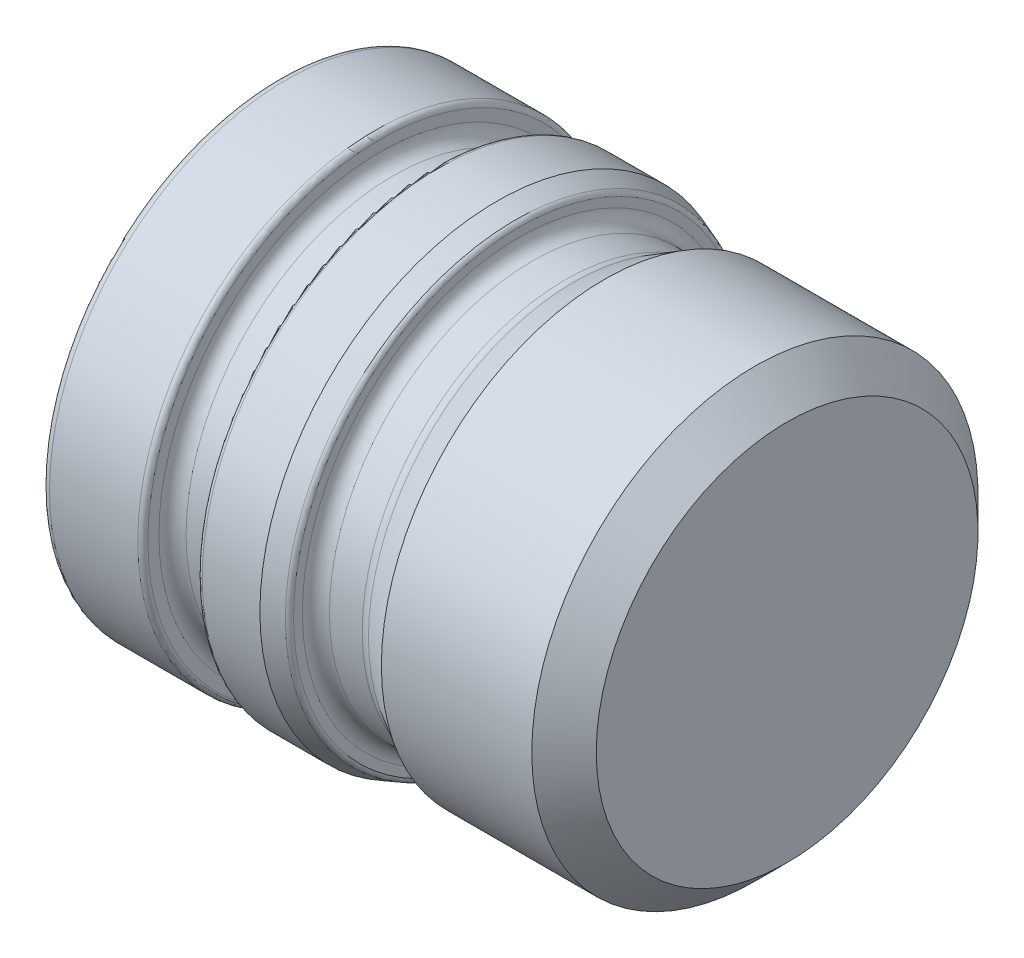
ISO-10303-21;
HEADER;
FILE_DESCRIPTION(('STEP AP214'),'2;1');
FILE_NAME('part.step','',(''),(''),'','','');
FILE_SCHEMA(('AUTOMOTIVE_DESIGN { 1 0 10303 214 1 1 1 1 }'));
ENDSEC;
DATA;
#1=APPLICATION_CONTEXT('core data for automotive mechanical design processes');
#2=APPLICATION_PROTOCOL_DEFINITION('international standard','automotive_design',2000,#1);
#3=PRODUCT_CONTEXT('',#1,'mechanical');
#4=PRODUCT('Part','Part','',(#3));
#5=PRODUCT_RELATED_PRODUCT_CATEGORY('part','',(#4));
#6=PRODUCT_DEFINITION_FORMATION('','',#4);
#7=PRODUCT_DEFINITION_CONTEXT('part definition',#1,'design');
#8=PRODUCT_DEFINITION('design','',#6,#7);
#9=PRODUCT_DEFINITION_SHAPE('','',#8);
#10=(LENGTH_UNIT() NAMED_UNIT(*) SI_UNIT(.MILLI.,.METRE.));
#11=(NAMED_UNIT(*) PLANE_ANGLE_UNIT() SI_UNIT($,.RADIAN.));
#12=(NAMED_UNIT(*) SI_UNIT($,.STERADIAN.) SOLID_ANGLE_UNIT());
#13=UNCERTAINTY_MEASURE_WITH_UNIT(LENGTH_MEASURE(1.E-05),#10,'distance_accuracy_value','');
#14=(GEOMETRIC_REPRESENTATION_CONTEXT(3) GLOBAL_UNCERTAINTY_ASSIGNED_CONTEXT((#13)) GLOBAL_UNIT_ASSIGNED_CONTEXT((#10,
#11,#12)) REPRESENTATION_CONTEXT('',''));
#15=CARTESIAN_POINT('',(0.,0.,0.));
#16=DIRECTION('',(0.,0.,1.));
#17=DIRECTION('',(1.,0.,0.));
#18=AXIS2_PLACEMENT_3D('',#15,#16,#17);
#19=CARTESIAN_POINT('',(-30.,13.475,0.));
#20=DIRECTION('',(1.,0.,0.));
#21=DIRECTION('',(0.,0.,-1.));
#22=AXIS2_PLACEMENT_3D('',#19,#20,#21);
#23=PLANE('',#22);
#24=DIRECTION('',(0.,1.,0.));
#25=VECTOR('',#24,1.);
#26=CARTESIAN_POINT('',(-30.,13.475,-5.5));
#27=LINE('',#26,#25);
#28=CARTESIAN_POINT('',(-30.,-2.32605970270163,-5.5));
#29=VERTEX_POINT('',#28);
#30=CARTESIAN_POINT('',(-30.,2.32605970270163,-5.5));
#31=VERTEX_POINT('',#30);
#32=EDGE_CURVE('E253',#29,#31,#27,.T.);
#33=ORIENTED_EDGE('',*,*,#32,.T.);
#34=CARTESIAN_POINT('',(-30.,3.8,-3.8));
#35=DIRECTION('',(1.,0.,0.));
#36=DIRECTION('',(0.,0.,-1.));
#37=AXIS2_PLACEMENT_3D('',#34,#35,#36);
#38=CIRCLE('',#37,2.25);
#39=CARTESIAN_POINT('',(-30.,5.5,-2.32605970270163));
#40=VERTEX_POINT('',#39);
#41=EDGE_CURVE('E255',#31,#40,#38,.T.);
#42=ORIENTED_EDGE('',*,*,#41,.T.);
#43=DIRECTION('',(0.,0.,1.));
#44=VECTOR('',#43,1.);
#45=CARTESIAN_POINT('',(-30.,5.5,0.));
#46=LINE('',#45,#44);
#47=CARTESIAN_POINT('',(-30.,5.5,2.32605970270163));
#48=VERTEX_POINT('',#47);
#49=EDGE_CURVE('E241',#40,#48,#46,.T.);
#50=ORIENTED_EDGE('',*,*,#49,.T.);
#51=CARTESIAN_POINT('',(-30.,3.8,3.8));
#52=DIRECTION('',(1.,0.,0.));
#53=DIRECTION('',(0.,0.,-1.));
#54=AXIS2_PLACEMENT_3D('',#51,#52,#53);
#55=CIRCLE('',#54,2.25);
#56=CARTESIAN_POINT('',(-30.,2.32605970270163,5.5));
#57=VERTEX_POINT('',#56);
#58=EDGE_CURVE('E243',#48,#57,#55,.T.);
#59=ORIENTED_EDGE('',*,*,#58,.T.);
#60=DIRECTION('',(0.,-1.,0.));
#61=VECTOR('',#60,1.);
#62=CARTESIAN_POINT('',(-30.,13.475,5.5));
#63=LINE('',#62,#61);
#64=CARTESIAN_POINT('',(-30.,-2.32605970270163,5.5));
#65=VERTEX_POINT('',#64);
#66=EDGE_CURVE('E245',#57,#65,#63,.T.);
#67=ORIENTED_EDGE('',*,*,#66,.T.);
#68=CARTESIAN_POINT('',(-30.,-3.8,3.8));
#69=DIRECTION('',(1.,0.,0.));
#70=DIRECTION('',(0.,0.,-1.));
#71=AXIS2_PLACEMENT_3D('',#68,#69,#70);
#72=CIRCLE('',#71,2.25);
#73=CARTESIAN_POINT('',(-30.,-5.25,2.07953494659147));
#74=VERTEX_POINT('',#73);
#75=EDGE_CURVE('E247',#65,#74,#72,.T.);
#76=ORIENTED_EDGE('',*,*,#75,.T.);
#77=DIRECTION('',(0.,0.,-1.));
#78=VECTOR('',#77,1.);
#79=CARTESIAN_POINT('',(-30.,-5.25,0.));
#80=LINE('',#79,#78);
#81=CARTESIAN_POINT('',(-30.,-5.25,-2.07953494659147));
#82=VERTEX_POINT('',#81);
#83=EDGE_CURVE('E249',#74,#82,#80,.T.);
#84=ORIENTED_EDGE('',*,*,#83,.T.);
#85=CARTESIAN_POINT('',(-30.,-3.8,-3.8));
#86=DIRECTION('',(1.,0.,0.));
#87=DIRECTION('',(0.,0.,-1.));
#88=AXIS2_PLACEMENT_3D('',#85,#86,#87);
#89=CIRCLE('',#88,2.25);
#90=EDGE_CURVE('E251',#82,#29,#89,.T.);
#91=ORIENTED_EDGE('',*,*,#90,.T.);
#92=EDGE_LOOP('',(#33,#42,#50,#59,#67,#76,#84,#91));
#93=FACE_BOUND('',#92,.T.);
#94=CARTESIAN_POINT('',(-30.,0.,0.));
#95=DIRECTION('',(-1.,0.,0.));
#96=DIRECTION('',(0.,0.,1.));
#97=AXIS2_PLACEMENT_3D('',#94,#95,#96);
#98=CIRCLE('',#97,13.475);
#99=CARTESIAN_POINT('',(-30.,0.,13.475));
#100=VERTEX_POINT('',#99);
#101=EDGE_CURVE('E237',#100,#100,#98,.T.);
#102=ORIENTED_EDGE('',*,*,#101,.T.);
#103=EDGE_LOOP('',(#102));
#104=FACE_BOUND('',#103,.T.);
#105=ADVANCED_FACE('F45',(#93,#104),#23,.F.);
#106=CARTESIAN_POINT('',(-29.5,0.,0.));
#107=DIRECTION('',(-1.,0.,0.));
#108=DIRECTION('',(0.,0.,1.));
#109=AXIS2_PLACEMENT_3D('',#106,#107,#108);
#110=TOROIDAL_SURFACE('',#109,13.475,0.5);
#111=ORIENTED_EDGE('',*,*,#101,.F.);
#112=EDGE_LOOP('',(#111));
#113=FACE_BOUND('',#112,.T.);
#114=CARTESIAN_POINT('',(-29.5,0.,0.));
#115=DIRECTION('',(-1.,0.,0.));
#116=DIRECTION('',(0.,0.,1.));
#117=AXIS2_PLACEMENT_3D('',#114,#115,#116);
#118=CIRCLE('',#117,13.975);
#119=CARTESIAN_POINT('',(-29.5,0.,13.975));
#120=VERTEX_POINT('',#119);
#121=EDGE_CURVE('E234',#120,#120,#118,.T.);
#122=ORIENTED_EDGE('',*,*,#121,.T.);
#123=EDGE_LOOP('',(#122));
#124=FACE_BOUND('',#123,.T.);
#125=ADVANCED_FACE('F351',(#113,#124),#110,.T.);
#126=CARTESIAN_POINT('',(0.,0.,0.));
#127=DIRECTION('',(-1.,0.,0.));
#128=DIRECTION('',(0.,0.,1.));
#129=AXIS2_PLACEMENT_3D('',#126,#127,#128);
#130=CYLINDRICAL_SURFACE('',#129,13.975);
#131=ORIENTED_EDGE('',*,*,#121,.F.);
#132=EDGE_LOOP('',(#131));
#133=FACE_BOUND('',#132,.T.);
#134=CARTESIAN_POINT('',(-24.3,0.,0.));
#135=DIRECTION('',(-1.,0.,0.));
#136=DIRECTION('',(0.,0.,1.));
#137=AXIS2_PLACEMENT_3D('',#134,#135,#136);
#138=CIRCLE('',#137,13.975);
#139=CARTESIAN_POINT('',(-24.3,0.,13.975));
#140=VERTEX_POINT('',#139);
#141=EDGE_CURVE('E231',#140,#140,#138,.T.);
#142=ORIENTED_EDGE('',*,*,#141,.T.);
#143=EDGE_LOOP('',(#142));
#144=FACE_BOUND('',#143,.T.);
#145=ADVANCED_FACE('F358',(#133,#144),#130,.T.);
#146=CARTESIAN_POINT('',(-24.3,0.,0.));
#147=DIRECTION('',(-1.,0.,0.));
#148=DIRECTION('',(0.,0.,1.));
#149=AXIS2_PLACEMENT_3D('',#146,#147,#148);
#150=TOROIDAL_SURFACE('',#149,13.675,0.300000000000001);
#151=ORIENTED_EDGE('',*,*,#141,.F.);
#152=EDGE_LOOP('',(#151));
#153=FACE_BOUND('',#152,.T.);
#154=CARTESIAN_POINT('',(-24.,0.,0.));
#155=DIRECTION('',(-1.,0.,0.));
#156=DIRECTION('',(0.,0.,1.));
#157=AXIS2_PLACEMENT_3D('',#154,#155,#156);
#158=CIRCLE('',#157,13.675);
#159=CARTESIAN_POINT('',(-24.,0.,13.675));
#160=VERTEX_POINT('',#159);
#161=EDGE_CURVE('E228',#160,#160,#158,.T.);
#162=ORIENTED_EDGE('',*,*,#161,.T.);
#163=EDGE_LOOP('',(#162));
#164=FACE_BOUND('',#163,.T.);
#165=ADVANCED_FACE('F365',(#153,#164),#150,.T.);
#166=CARTESIAN_POINT('',(-24.,13.025,0.));
#167=DIRECTION('',(-1.,0.,0.));
#168=DIRECTION('',(0.,0.,1.));
#169=AXIS2_PLACEMENT_3D('',#166,#167,#168);
#170=PLANE('',#169);
#171=ORIENTED_EDGE('',*,*,#161,.F.);
#172=EDGE_LOOP('',(#171));
#173=FACE_BOUND('',#172,.T.);
#174=CARTESIAN_POINT('',(-24.,0.,0.));
#175=DIRECTION('',(-1.,0.,0.));
#176=DIRECTION('',(0.,0.,1.));
#177=AXIS2_PLACEMENT_3D('',#174,#175,#176);
#178=CIRCLE('',#177,13.025);
#179=CARTESIAN_POINT('',(-24.,0.,13.025));
#180=VERTEX_POINT('',#179);
#181=EDGE_CURVE('E225',#180,#180,#178,.T.);
#182=ORIENTED_EDGE('',*,*,#181,.T.);
#183=EDGE_LOOP('',(#182));
#184=FACE_BOUND('',#183,.T.);
#185=ADVANCED_FACE('F369',(#173,#184),#170,.F.);
#186=CARTESIAN_POINT('',(-23.2,0.,0.));
#187=DIRECTION('',(-1.,0.,0.));
#188=DIRECTION('',(0.,0.,1.));
#189=AXIS2_PLACEMENT_3D('',#186,#187,#188);
#190=TOROIDAL_SURFACE('',#189,13.025,0.799999999999999);
#191=ORIENTED_EDGE('',*,*,#181,.F.);
#192=EDGE_LOOP('',(#191));
#193=FACE_BOUND('',#192,.T.);
#194=CARTESIAN_POINT('',(-23.2,0.,0.));
#195=DIRECTION('',(-1.,0.,0.));
#196=DIRECTION('',(0.,0.,1.));
#197=AXIS2_PLACEMENT_3D('',#194,#195,#196);
#198=CIRCLE('',#197,12.225);
#199=CARTESIAN_POINT('',(-23.2,0.,12.225));
#200=VERTEX_POINT('',#199);
#201=EDGE_CURVE('E222',#200,#200,#198,.T.);
#202=ORIENTED_EDGE('',*,*,#201,.T.);
#203=EDGE_LOOP('',(#202));
#204=FACE_BOUND('',#203,.T.);
#205=ADVANCED_FACE('F373',(#193,#204),#190,.F.);
#206=CARTESIAN_POINT('',(0.,0.,0.));
#207=DIRECTION('',(-1.,0.,0.));
#208=DIRECTION('',(0.,0.,1.));
#209=AXIS2_PLACEMENT_3D('',#206,#207,#208);
#210=CYLINDRICAL_SURFACE('',#209,12.225);
#211=ORIENTED_EDGE('',*,*,#201,.F.);
#212=EDGE_LOOP('',(#211));
#213=FACE_BOUND('',#212,.T.);
#214=CARTESIAN_POINT('',(-21.6,0.,0.));
#215=DIRECTION('',(-1.,0.,0.));
#216=DIRECTION('',(0.,0.,1.));
#217=AXIS2_PLACEMENT_3D('',#214,#215,#216);
#218=CIRCLE('',#217,12.225);
#219=CARTESIAN_POINT('',(-21.6,0.,12.225));
#220=VERTEX_POINT('',#219);
#221=EDGE_CURVE('E219',#220,#220,#218,.T.);
#222=ORIENTED_EDGE('',*,*,#221,.T.);
#223=EDGE_LOOP('',(#222));
#224=FACE_BOUND('',#223,.T.);
#225=ADVANCED_FACE('F377',(#213,#224),#210,.T.);
#226=CARTESIAN_POINT('',(-21.6,0.,0.));
#227=DIRECTION('',(-1.,0.,0.));
#228=DIRECTION('',(0.,0.,1.));
#229=AXIS2_PLACEMENT_3D('',#226,#227,#228);
#230=TOROIDAL_SURFACE('',#229,13.025,0.800000000000001);
#231=ORIENTED_EDGE('',*,*,#221,.F.);
#232=EDGE_LOOP('',(#231));
#233=FACE_BOUND('',#232,.T.);
#234=CARTESIAN_POINT('',(-20.8,0.,0.));
#235=DIRECTION('',(-1.,0.,0.));
#236=DIRECTION('',(0.,0.,1.));
#237=AXIS2_PLACEMENT_3D('',#234,#235,#236);
#238=CIRCLE('',#237,13.025);
#239=CARTESIAN_POINT('',(-20.8,0.,13.025));
#240=VERTEX_POINT('',#239);
#241=EDGE_CURVE('E216',#240,#240,#238,.T.);
#242=ORIENTED_EDGE('',*,*,#241,.T.);
#243=EDGE_LOOP('',(#242));
#244=FACE_BOUND('',#243,.T.);
#245=ADVANCED_FACE('F381',(#233,#244),#230,.F.);
#246=CARTESIAN_POINT('',(-20.8,13.675,0.));
#247=DIRECTION('',(1.,0.,0.));
#248=DIRECTION('',(0.,0.,-1.));
#249=AXIS2_PLACEMENT_3D('',#246,#247,#248);
#250=PLANE('',#249);
#251=ORIENTED_EDGE('',*,*,#241,.F.);
#252=EDGE_LOOP('',(#251));
#253=FACE_BOUND('',#252,.T.);
#254=CARTESIAN_POINT('',(-20.8,0.,0.));
#255=DIRECTION('',(-1.,0.,0.));
#256=DIRECTION('',(0.,0.,1.));
#257=AXIS2_PLACEMENT_3D('',#254,#255,#256);
#258=CIRCLE('',#257,13.675);
#259=CARTESIAN_POINT('',(-20.8,0.,13.675));
#260=VERTEX_POINT('',#259);
#261=EDGE_CURVE('E213',#260,#260,#258,.T.);
#262=ORIENTED_EDGE('',*,*,#261,.T.);
#263=EDGE_LOOP('',(#262));
#264=FACE_BOUND('',#263,.T.);
#265=ADVANCED_FACE('F385',(#253,#264),#250,.F.);
#266=CARTESIAN_POINT('',(-20.5,0.,0.));
#267=DIRECTION('',(-1.,0.,0.));
#268=DIRECTION('',(0.,0.,1.));
#269=AXIS2_PLACEMENT_3D('',#266,#267,#268);
#270=TOROIDAL_SURFACE('',#269,13.675,0.299999999999998);
#271=ORIENTED_EDGE('',*,*,#261,.F.);
#272=EDGE_LOOP('',(#271));
#273=FACE_BOUND('',#272,.T.);
#274=CARTESIAN_POINT('',(-20.5,0.,0.));
#275=DIRECTION('',(-1.,0.,0.));
#276=DIRECTION('',(0.,0.,1.));
#277=AXIS2_PLACEMENT_3D('',#274,#275,#276);
#278=CIRCLE('',#277,13.975);
#279=CARTESIAN_POINT('',(-20.5,0.,13.975));
#280=VERTEX_POINT('',#279);
#281=EDGE_CURVE('E210',#280,#280,#278,.T.);
#282=ORIENTED_EDGE('',*,*,#281,.T.);
#283=EDGE_LOOP('',(#282));
#284=FACE_BOUND('',#283,.T.);
#285=ADVANCED_FACE('F389',(#273,#284),#270,.T.);
#286=CARTESIAN_POINT('',(0.,0.,0.));
#287=DIRECTION('',(-1.,0.,0.));
#288=DIRECTION('',(0.,0.,1.));
#289=AXIS2_PLACEMENT_3D('',#286,#287,#288);
#290=CYLINDRICAL_SURFACE('',#289,13.975);
#291=ORIENTED_EDGE('',*,*,#281,.F.);
#292=EDGE_LOOP('',(#291));
#293=FACE_BOUND('',#292,.T.);
#294=CARTESIAN_POINT('',(-17.1,0.,0.));
#295=DIRECTION('',(-1.,0.,0.));
#296=DIRECTION('',(0.,0.,1.));
#297=AXIS2_PLACEMENT_3D('',#294,#295,#296);
#298=CIRCLE('',#297,13.975);
#299=CARTESIAN_POINT('',(-17.1,0.,13.975));
#300=VERTEX_POINT('',#299);
#301=EDGE_CURVE('E207',#300,#300,#298,.T.);
#302=ORIENTED_EDGE('',*,*,#301,.T.);
#303=EDGE_LOOP('',(#302));
#304=FACE_BOUND('',#303,.T.);
#305=ADVANCED_FACE('F393',(#293,#304),#290,.T.);
#306=CARTESIAN_POINT('',(-15.9973939570023,0.,0.));
#307=DIRECTION('',(-1.,0.,0.));
#308=DIRECTION('',(0.,0.,1.));
#309=AXIS2_PLACEMENT_3D('',#306,#307,#308);
#310=CONICAL_SURFACE('',#309,13.5736842202268,0.349065850398858);
#311=ORIENTED_EDGE('',*,*,#301,.F.);
#312=EDGE_LOOP('',(#311));
#313=FACE_BOUND('',#312,.T.);
#314=CARTESIAN_POINT('',(-15.9973939570023,0.,0.));
#315=DIRECTION('',(-1.,0.,0.));
#316=DIRECTION('',(0.,0.,1.));
#317=AXIS2_PLACEMENT_3D('',#314,#315,#316);
#318=CIRCLE('',#317,13.5736842202268);
#319=CARTESIAN_POINT('',(-15.9973939570023,0.,13.5736842202268));
#320=VERTEX_POINT('',#319);
#321=EDGE_CURVE('E204',#320,#320,#318,.T.);
#322=ORIENTED_EDGE('',*,*,#321,.T.);
#323=EDGE_LOOP('',(#322));
#324=FACE_BOUND('',#323,.T.);
#325=ADVANCED_FACE('F397',(#313,#324),#310,.T.);
#326=CARTESIAN_POINT('',(-16.1,0.,0.));
#327=DIRECTION('',(-1.,0.,0.));
#328=DIRECTION('',(0.,0.,1.));
#329=AXIS2_PLACEMENT_3D('',#326,#327,#328);
#330=TOROIDAL_SURFACE('',#329,13.291776433991,0.300000000000002);
#331=ORIENTED_EDGE('',*,*,#321,.F.);
#332=EDGE_LOOP('',(#331));
#333=FACE_BOUND('',#332,.T.);
#334=CARTESIAN_POINT('',(-15.8,0.,0.));
#335=DIRECTION('',(-1.,0.,0.));
#336=DIRECTION('',(0.,0.,1.));
#337=AXIS2_PLACEMENT_3D('',#334,#335,#336);
#338=CIRCLE('',#337,13.291776433991);
#339=CARTESIAN_POINT('',(-15.8,0.,13.291776433991));
#340=VERTEX_POINT('',#339);
#341=EDGE_CURVE('E201',#340,#340,#338,.T.);
#342=ORIENTED_EDGE('',*,*,#341,.T.);
#343=EDGE_LOOP('',(#342));
#344=FACE_BOUND('',#343,.T.);
#345=ADVANCED_FACE('F401',(#333,#344),#330,.T.);
#346=CARTESIAN_POINT('',(-15.8,12.775,0.));
#347=DIRECTION('',(-1.,0.,0.));
#348=DIRECTION('',(0.,0.,1.));
#349=AXIS2_PLACEMENT_3D('',#346,#347,#348);
#350=PLANE('',#349);
#351=ORIENTED_EDGE('',*,*,#341,.F.);
#352=EDGE_LOOP('',(#351));
#353=FACE_BOUND('',#352,.T.);
#354=CARTESIAN_POINT('',(-15.8,0.,0.));
#355=DIRECTION('',(-1.,0.,0.));
#356=DIRECTION('',(0.,0.,1.));
#357=AXIS2_PLACEMENT_3D('',#354,#355,#356);
#358=CIRCLE('',#357,12.775);
#359=CARTESIAN_POINT('',(-15.8,0.,12.775));
#360=VERTEX_POINT('',#359);
#361=EDGE_CURVE('E198',#360,#360,#358,.T.);
#362=ORIENTED_EDGE('',*,*,#361,.T.);
#363=EDGE_LOOP('',(#362));
#364=FACE_BOUND('',#363,.T.);
#365=ADVANCED_FACE('F405',(#353,#364),#350,.F.);
#366=CARTESIAN_POINT('',(-15.,0.,0.));
#367=DIRECTION('',(-1.,0.,0.));
#368=DIRECTION('',(0.,0.,1.));
#369=AXIS2_PLACEMENT_3D('',#366,#367,#368);
#370=TOROIDAL_SURFACE('',#369,12.775,0.8);
#371=ORIENTED_EDGE('',*,*,#361,.F.);
#372=EDGE_LOOP('',(#371));
#373=FACE_BOUND('',#372,.T.);
#374=CARTESIAN_POINT('',(-15.,0.,0.));
#375=DIRECTION('',(-1.,0.,0.));
#376=DIRECTION('',(0.,0.,1.));
#377=AXIS2_PLACEMENT_3D('',#374,#375,#376);
#378=CIRCLE('',#377,11.975);
#379=CARTESIAN_POINT('',(-15.,0.,11.975));
#380=VERTEX_POINT('',#379);
#381=EDGE_CURVE('E195',#380,#380,#378,.T.);
#382=ORIENTED_EDGE('',*,*,#381,.T.);
#383=EDGE_LOOP('',(#382));
#384=FACE_BOUND('',#383,.T.);
#385=ADVANCED_FACE('F409',(#373,#384),#370,.F.);
#386=CARTESIAN_POINT('',(0.,0.,0.));
#387=DIRECTION('',(-1.,0.,0.));
#388=DIRECTION('',(0.,0.,1.));
#389=AXIS2_PLACEMENT_3D('',#386,#387,#388);
#390=CYLINDRICAL_SURFACE('',#389,11.975);
#391=ORIENTED_EDGE('',*,*,#381,.F.);
#392=EDGE_LOOP('',(#391));
#393=FACE_BOUND('',#392,.T.);
#394=CARTESIAN_POINT('',(-13.0679491924311,0.,0.));
#395=DIRECTION('',(-1.,0.,0.));
#396=DIRECTION('',(0.,0.,1.));
#397=AXIS2_PLACEMENT_3D('',#394,#395,#396);
#398=CIRCLE('',#397,11.975);
#399=CARTESIAN_POINT('',(-13.0679491924311,0.,11.975));
#400=VERTEX_POINT('',#399);
#401=EDGE_CURVE('E192',#400,#400,#398,.T.);
#402=ORIENTED_EDGE('',*,*,#401,.T.);
#403=EDGE_LOOP('',(#402));
#404=FACE_BOUND('',#403,.T.);
#405=ADVANCED_FACE('F413',(#393,#404),#390,.T.);
#406=CARTESIAN_POINT('',(-13.0679491924311,0.,0.));
#407=DIRECTION('',(-1.,0.,0.));
#408=DIRECTION('',(0.,0.,1.));
#409=AXIS2_PLACEMENT_3D('',#406,#407,#408);
#410=TOROIDAL_SURFACE('',#409,12.975,1.);
#411=ORIENTED_EDGE('',*,*,#401,.F.);
#412=EDGE_LOOP('',(#411));
#413=FACE_BOUND('',#412,.T.);
#414=CARTESIAN_POINT('',(-12.5679491924311,0.,0.));
#415=DIRECTION('',(-1.,0.,0.));
#416=DIRECTION('',(0.,0.,1.));
#417=AXIS2_PLACEMENT_3D('',#414,#415,#416);
#418=CIRCLE('',#417,12.1089745962156);
#419=CARTESIAN_POINT('',(-12.5679491924311,0.,12.1089745962156));
#420=VERTEX_POINT('',#419);
#421=EDGE_CURVE('E189',#420,#420,#418,.T.);
#422=ORIENTED_EDGE('',*,*,#421,.T.);
#423=EDGE_LOOP('',(#422));
#424=FACE_BOUND('',#423,.T.);
#425=ADVANCED_FACE('F417',(#413,#424),#410,.F.);
#426=CARTESIAN_POINT('',(-10.7648403011066,0.,0.));
#427=DIRECTION('',(1.,0.,0.));
#428=DIRECTION('',(0.,0.,-1.));
#429=AXIS2_PLACEMENT_3D('',#426,#427,#428);
#430=CONICAL_SURFACE('',#429,13.15,0.5235987755983);
#431=ORIENTED_EDGE('',*,*,#421,.F.);
#432=EDGE_LOOP('',(#431));
#433=FACE_BOUND('',#432,.T.);
#434=CARTESIAN_POINT('',(-10.7648403011066,0.,0.));
#435=DIRECTION('',(-1.,0.,0.));
#436=DIRECTION('',(0.,0.,1.));
#437=AXIS2_PLACEMENT_3D('',#434,#435,#436);
#438=CIRCLE('',#437,13.15);
#439=CARTESIAN_POINT('',(-10.7648403011066,0.,13.15));
#440=VERTEX_POINT('',#439);
#441=EDGE_CURVE('E186',#440,#440,#438,.T.);
#442=ORIENTED_EDGE('',*,*,#441,.T.);
#443=EDGE_LOOP('',(#442));
#444=FACE_BOUND('',#443,.T.);
#445=ADVANCED_FACE('F421',(#433,#444),#430,.T.);
#446=CARTESIAN_POINT('',(0.,0.,0.));
#447=DIRECTION('',(-1.,0.,0.));
#448=DIRECTION('',(0.,0.,1.));
#449=AXIS2_PLACEMENT_3D('',#446,#447,#448);
#450=CYLINDRICAL_SURFACE('',#449,13.15);
#451=ORIENTED_EDGE('',*,*,#441,.F.);
#452=EDGE_LOOP('',(#451));
#453=FACE_BOUND('',#452,.T.);
#454=CARTESIAN_POINT('',(-1.89999999999999,0.,0.));
#455=DIRECTION('',(-1.,0.,0.));
#456=DIRECTION('',(0.,0.,1.));
#457=AXIS2_PLACEMENT_3D('',#454,#455,#456);
#458=CIRCLE('',#457,13.15);
#459=CARTESIAN_POINT('',(-1.89999999999999,0.,13.15));
#460=VERTEX_POINT('',#459);
#461=EDGE_CURVE('E183',#460,#460,#458,.T.);
#462=ORIENTED_EDGE('',*,*,#461,.T.);
#463=EDGE_LOOP('',(#462));
#464=FACE_BOUND('',#463,.T.);
#465=ADVANCED_FACE('F425',(#453,#464),#450,.T.);
#466=CARTESIAN_POINT('',(0.,0.,0.));
#467=DIRECTION('',(-1.,0.,0.));
#468=DIRECTION('',(0.,0.,1.));
#469=AXIS2_PLACEMENT_3D('',#466,#467,#468);
#470=CONICAL_SURFACE('',#469,11.25,0.78539816339745);
#471=ORIENTED_EDGE('',*,*,#461,.F.);
#472=EDGE_LOOP('',(#471));
#473=FACE_BOUND('',#472,.T.);
#474=CARTESIAN_POINT('',(0.,0.,0.));
#475=DIRECTION('',(-1.,0.,0.));
#476=DIRECTION('',(0.,0.,1.));
#477=AXIS2_PLACEMENT_3D('',#474,#475,#476);
#478=CIRCLE('',#477,11.25);
#479=CARTESIAN_POINT('',(0.,0.,11.25));
#480=VERTEX_POINT('',#479);
#481=EDGE_CURVE('E180',#480,#480,#478,.T.);
#482=ORIENTED_EDGE('',*,*,#481,.T.);
#483=EDGE_LOOP('',(#482));
#484=FACE_BOUND('',#483,.T.);
#485=ADVANCED_FACE('F429',(#473,#484),#470,.T.);
#486=CARTESIAN_POINT('',(0.,0.,0.));
#487=DIRECTION('',(-1.,0.,0.));
#488=DIRECTION('',(0.,0.,1.));
#489=AXIS2_PLACEMENT_3D('',#486,#487,#488);
#490=PLANE('',#489);
#491=ORIENTED_EDGE('',*,*,#481,.F.);
#492=EDGE_LOOP('',(#491));
#493=FACE_BOUND('',#492,.T.);
#494=ADVANCED_FACE('F433',(#493),#490,.F.);
#495=CARTESIAN_POINT('',(-20.,5.,-5.));
#496=DIRECTION('',(0.,0.,-1.));
#497=DIRECTION('',(0.,1.,0.));
#498=AXIS2_PLACEMENT_3D('',#495,#496,#497);
#499=PLANE('',#498);
#500=DIRECTION('',(-1.,0.,0.));
#501=VECTOR('',#500,1.);
#502=CARTESIAN_POINT('',(-15.0502525316942,2.5262260797143,-5.));
#503=LINE('',#502,#501);
#504=CARTESIAN_POINT('',(-20.,2.5262260797143,-5.));
#505=VERTEX_POINT('',#504);
#506=CARTESIAN_POINT('',(-29.5,2.5262260797143,-5.));
#507=VERTEX_POINT('',#506);
#508=EDGE_CURVE('E141',#505,#507,#503,.T.);
#509=ORIENTED_EDGE('',*,*,#508,.T.);
#510=DIRECTION('',(0.,-1.,0.));
#511=VECTOR('',#510,1.);
#512=CARTESIAN_POINT('',(-29.5,5.,-5.));
#513=LINE('',#512,#511);
#514=CARTESIAN_POINT('',(-29.5,-2.5262260797143,-5.));
#515=VERTEX_POINT('',#514);
#516=EDGE_CURVE('E258',#507,#515,#513,.T.);
#517=ORIENTED_EDGE('',*,*,#516,.T.);
#518=DIRECTION('',(-1.,0.,0.));
#519=VECTOR('',#518,1.);
#520=CARTESIAN_POINT('',(-15.0502525316942,-2.5262260797143,-5.));
#521=LINE('',#520,#519);
#522=CARTESIAN_POINT('',(-20.,-2.5262260797143,-5.));
#523=VERTEX_POINT('',#522);
#524=EDGE_CURVE('E165',#515,#523,#521,.F.);
#525=ORIENTED_EDGE('',*,*,#524,.T.);
#526=DIRECTION('',(0.,-1.,0.));
#527=VECTOR('',#526,1.);
#528=CARTESIAN_POINT('',(-20.,5.,-5.));
#529=LINE('',#528,#527);
#530=EDGE_CURVE('E157',#505,#523,#529,.T.);
#531=ORIENTED_EDGE('',*,*,#530,.F.);
#532=EDGE_LOOP('',(#509,#517,#525,#531));
#533=FACE_BOUND('',#532,.T.);
#534=ADVANCED_FACE('F163',(#533),#499,.F.);
#535=CARTESIAN_POINT('',(-20.,5.,-5.));
#536=DIRECTION('',(0.,1.,0.));
#537=DIRECTION('',(0.,0.,1.));
#538=AXIS2_PLACEMENT_3D('',#535,#536,#537);
#539=PLANE('',#538);
#540=DIRECTION('',(-1.,0.,0.));
#541=VECTOR('',#540,1.);
#542=CARTESIAN_POINT('',(-15.0502525316942,5.,2.5262260797143));
#543=LINE('',#542,#541);
#544=CARTESIAN_POINT('',(-20.,5.,2.5262260797143));
#545=VERTEX_POINT('',#544);
#546=CARTESIAN_POINT('',(-29.5,5.,2.5262260797143));
#547=VERTEX_POINT('',#546);
#548=EDGE_CURVE('E168',#545,#547,#543,.T.);
#549=ORIENTED_EDGE('',*,*,#548,.T.);
#550=DIRECTION('',(0.,0.,-1.));
#551=VECTOR('',#550,1.);
#552=CARTESIAN_POINT('',(-29.5,5.,-5.));
#553=LINE('',#552,#551);
#554=CARTESIAN_POINT('',(-29.5,5.,-2.5262260797143));
#555=VERTEX_POINT('',#554);
#556=EDGE_CURVE('E11',#547,#555,#553,.T.);
#557=ORIENTED_EDGE('',*,*,#556,.T.);
#558=DIRECTION('',(-1.,0.,0.));
#559=VECTOR('',#558,1.);
#560=CARTESIAN_POINT('',(-15.0502525316942,5.,-2.5262260797143));
#561=LINE('',#560,#559);
#562=CARTESIAN_POINT('',(-20.,5.,-2.5262260797143));
#563=VERTEX_POINT('',#562);
#564=EDGE_CURVE('E152',#555,#563,#561,.F.);
#565=ORIENTED_EDGE('',*,*,#564,.T.);
#566=DIRECTION('',(0.,0.,-1.));
#567=VECTOR('',#566,1.);
#568=CARTESIAN_POINT('',(-20.,5.,-5.));
#569=LINE('',#568,#567);
#570=EDGE_CURVE('E160',#545,#563,#569,.T.);
#571=ORIENTED_EDGE('',*,*,#570,.F.);
#572=EDGE_LOOP('',(#549,#557,#565,#571));
#573=FACE_BOUND('',#572,.T.);
#574=ADVANCED_FACE('F439',(#573),#539,.F.);
#575=CARTESIAN_POINT('',(-20.,5.,5.));
#576=DIRECTION('',(0.,0.,1.));
#577=DIRECTION('',(0.,-1.,0.));
#578=AXIS2_PLACEMENT_3D('',#575,#576,#577);
#579=PLANE('',#578);
#580=DIRECTION('',(-1.,0.,0.));
#581=VECTOR('',#580,1.);
#582=CARTESIAN_POINT('',(-15.0502525316942,-2.5262260797143,5.));
#583=LINE('',#582,#581);
#584=CARTESIAN_POINT('',(-20.,-2.5262260797143,5.));
#585=VERTEX_POINT('',#584);
#586=CARTESIAN_POINT('',(-29.5,-2.5262260797143,5.));
#587=VERTEX_POINT('',#586);
#588=EDGE_CURVE('E471',#585,#587,#583,.T.);
#589=ORIENTED_EDGE('',*,*,#588,.T.);
#590=DIRECTION('',(0.,1.,0.));
#591=VECTOR('',#590,1.);
#592=CARTESIAN_POINT('',(-29.5,5.,5.));
#593=LINE('',#592,#591);
#594=CARTESIAN_POINT('',(-29.5,2.5262260797143,5.));
#595=VERTEX_POINT('',#594);
#596=EDGE_CURVE('E74',#587,#595,#593,.T.);
#597=ORIENTED_EDGE('',*,*,#596,.T.);
#598=DIRECTION('',(-1.,0.,0.));
#599=VECTOR('',#598,1.);
#600=CARTESIAN_POINT('',(-15.0502525316942,2.5262260797143,5.));
#601=LINE('',#600,#599);
#602=CARTESIAN_POINT('',(-20.,2.5262260797143,5.));
#603=VERTEX_POINT('',#602);
#604=EDGE_CURVE('E173',#595,#603,#601,.F.);
#605=ORIENTED_EDGE('',*,*,#604,.T.);
#606=DIRECTION('',(0.,1.,0.));
#607=VECTOR('',#606,1.);
#608=CARTESIAN_POINT('',(-20.,5.,5.));
#609=LINE('',#608,#607);
#610=EDGE_CURVE('E171',#585,#603,#609,.T.);
#611=ORIENTED_EDGE('',*,*,#610,.F.);
#612=EDGE_LOOP('',(#589,#597,#605,#611));
#613=FACE_BOUND('',#612,.T.);
#614=ADVANCED_FACE('F443',(#613),#579,.F.);
#615=CARTESIAN_POINT('',(-20.,-4.75,-5.));
#616=DIRECTION('',(0.,-1.,0.));
#617=DIRECTION('',(0.,0.,-1.));
#618=AXIS2_PLACEMENT_3D('',#615,#616,#617);
#619=PLANE('',#618);
#620=DIRECTION('',(-1.,0.,0.));
#621=VECTOR('',#620,1.);
#622=CARTESIAN_POINT('',(-15.0502525316942,-4.75,-2.33030615433009));
#623=LINE('',#622,#621);
#624=CARTESIAN_POINT('',(-20.,-4.75,-2.33030615433009));
#625=VERTEX_POINT('',#624);
#626=CARTESIAN_POINT('',(-29.5,-4.75,-2.33030615433009));
#627=VERTEX_POINT('',#626);
#628=EDGE_CURVE('E490',#625,#627,#623,.T.);
#629=ORIENTED_EDGE('',*,*,#628,.T.);
#630=DIRECTION('',(0.,0.,1.));
#631=VECTOR('',#630,1.);
#632=CARTESIAN_POINT('',(-29.5,-4.75,-5.));
#633=LINE('',#632,#631);
#634=CARTESIAN_POINT('',(-29.5,-4.75,2.33030615433009));
#635=VERTEX_POINT('',#634);
#636=EDGE_CURVE('E262',#627,#635,#633,.T.);
#637=ORIENTED_EDGE('',*,*,#636,.T.);
#638=DIRECTION('',(-1.,0.,0.));
#639=VECTOR('',#638,1.);
#640=CARTESIAN_POINT('',(-15.0502525316942,-4.75,2.33030615433009));
#641=LINE('',#640,#639);
#642=CARTESIAN_POINT('',(-20.,-4.75,2.33030615433009));
#643=VERTEX_POINT('',#642);
#644=EDGE_CURVE('E151',#635,#643,#641,.F.);
#645=ORIENTED_EDGE('',*,*,#644,.T.);
#646=DIRECTION('',(0.,0.,1.));
#647=VECTOR('',#646,1.);
#648=CARTESIAN_POINT('',(-20.,-4.75,-5.));
#649=LINE('',#648,#647);
#650=EDGE_CURVE('E167',#625,#643,#649,.T.);
#651=ORIENTED_EDGE('',*,*,#650,.F.);
#652=EDGE_LOOP('',(#629,#637,#645,#651));
#653=FACE_BOUND('',#652,.T.);
#654=ADVANCED_FACE('F440',(#653),#619,.F.);
#655=CARTESIAN_POINT('',(-20.,-4.75,-5.));
#656=DIRECTION('',(-1.,0.,0.));
#657=DIRECTION('',(0.,0.,1.));
#658=AXIS2_PLACEMENT_3D('',#655,#656,#657);
#659=PLANE('',#658);
#660=CARTESIAN_POINT('',(-20.,3.8,-3.8));
#661=DIRECTION('',(-1.,0.,0.));
#662=DIRECTION('',(0.,0.,1.));
#663=AXIS2_PLACEMENT_3D('',#660,#661,#662);
#664=CIRCLE('',#663,1.75);
#665=EDGE_CURVE('E145',#505,#563,#664,.F.);
#666=ORIENTED_EDGE('',*,*,#665,.F.);
#667=ORIENTED_EDGE('',*,*,#530,.T.);
#668=CARTESIAN_POINT('',(-20.,-3.8,-3.8));
#669=DIRECTION('',(-1.,0.,0.));
#670=DIRECTION('',(0.,0.,1.));
#671=AXIS2_PLACEMENT_3D('',#668,#669,#670);
#672=CIRCLE('',#671,1.75);
#673=EDGE_CURVE('E482',#625,#523,#672,.F.);
#674=ORIENTED_EDGE('',*,*,#673,.F.);
#675=ORIENTED_EDGE('',*,*,#650,.T.);
#676=CARTESIAN_POINT('',(-20.,-3.8,3.8));
#677=DIRECTION('',(-1.,0.,0.));
#678=DIRECTION('',(0.,0.,1.));
#679=AXIS2_PLACEMENT_3D('',#676,#677,#678);
#680=CIRCLE('',#679,1.75);
#681=EDGE_CURVE('E469',#585,#643,#680,.F.);
#682=ORIENTED_EDGE('',*,*,#681,.F.);
#683=ORIENTED_EDGE('',*,*,#610,.T.);
#684=CARTESIAN_POINT('',(-20.,3.8,3.8));
#685=DIRECTION('',(-1.,0.,0.));
#686=DIRECTION('',(0.,0.,1.));
#687=AXIS2_PLACEMENT_3D('',#684,#685,#686);
#688=CIRCLE('',#687,1.75);
#689=EDGE_CURVE('E161',#545,#603,#688,.F.);
#690=ORIENTED_EDGE('',*,*,#689,.F.);
#691=ORIENTED_EDGE('',*,*,#570,.T.);
#692=EDGE_LOOP('',(#666,#667,#674,#675,#682,#683,#690,#691));
#693=FACE_BOUND('',#692,.T.);
#694=ADVANCED_FACE('F156',(#693),#659,.T.);
#695=CARTESIAN_POINT('',(-15.0502525316942,-3.8,3.8));
#696=DIRECTION('',(-1.,0.,0.));
#697=DIRECTION('',(0.,0.,1.));
#698=AXIS2_PLACEMENT_3D('',#695,#696,#697);
#699=CYLINDRICAL_SURFACE('',#698,1.75);
#700=ORIENTED_EDGE('',*,*,#644,.F.);
#701=CARTESIAN_POINT('',(-29.5,-3.8,3.8));
#702=DIRECTION('',(1.,0.,0.));
#703=DIRECTION('',(0.,0.,-1.));
#704=AXIS2_PLACEMENT_3D('',#701,#702,#703);
#705=CIRCLE('',#704,1.75);
#706=EDGE_CURVE('E264',#635,#587,#705,.F.);
#707=ORIENTED_EDGE('',*,*,#706,.T.);
#708=ORIENTED_EDGE('',*,*,#588,.F.);
#709=ORIENTED_EDGE('',*,*,#681,.T.);
#710=EDGE_LOOP('',(#700,#707,#708,#709));
#711=FACE_BOUND('',#710,.T.);
#712=ADVANCED_FACE('F451',(#711),#699,.F.);
#713=CARTESIAN_POINT('',(-15.0502525316942,-3.8,-3.8));
#714=DIRECTION('',(-1.,0.,0.));
#715=DIRECTION('',(0.,0.,1.));
#716=AXIS2_PLACEMENT_3D('',#713,#714,#715);
#717=CYLINDRICAL_SURFACE('',#716,1.75);
#718=ORIENTED_EDGE('',*,*,#524,.F.);
#719=CARTESIAN_POINT('',(-29.5,-3.8,-3.8));
#720=DIRECTION('',(1.,0.,0.));
#721=DIRECTION('',(0.,0.,-1.));
#722=AXIS2_PLACEMENT_3D('',#719,#720,#721);
#723=CIRCLE('',#722,1.75);
#724=EDGE_CURVE('E260',#515,#627,#723,.F.);
#725=ORIENTED_EDGE('',*,*,#724,.T.);
#726=ORIENTED_EDGE('',*,*,#628,.F.);
#727=ORIENTED_EDGE('',*,*,#673,.T.);
#728=EDGE_LOOP('',(#718,#725,#726,#727));
#729=FACE_BOUND('',#728,.T.);
#730=ADVANCED_FACE('F455',(#729),#717,.F.);
#731=CARTESIAN_POINT('',(-15.0502525316942,3.8,3.8));
#732=DIRECTION('',(-1.,0.,0.));
#733=DIRECTION('',(0.,0.,1.));
#734=AXIS2_PLACEMENT_3D('',#731,#732,#733);
#735=CYLINDRICAL_SURFACE('',#734,1.75);
#736=ORIENTED_EDGE('',*,*,#604,.F.);
#737=CARTESIAN_POINT('',(-29.5,3.8,3.8));
#738=DIRECTION('',(1.,0.,0.));
#739=DIRECTION('',(0.,0.,-1.));
#740=AXIS2_PLACEMENT_3D('',#737,#738,#739);
#741=CIRCLE('',#740,1.75);
#742=EDGE_CURVE('E59',#595,#547,#741,.F.);
#743=ORIENTED_EDGE('',*,*,#742,.T.);
#744=ORIENTED_EDGE('',*,*,#548,.F.);
#745=ORIENTED_EDGE('',*,*,#689,.T.);
#746=EDGE_LOOP('',(#736,#743,#744,#745));
#747=FACE_BOUND('',#746,.T.);
#748=ADVANCED_FACE('F454',(#747),#735,.F.);
#749=CARTESIAN_POINT('',(-15.0502525316942,3.8,-3.8));
#750=DIRECTION('',(-1.,0.,0.));
#751=DIRECTION('',(0.,0.,1.));
#752=AXIS2_PLACEMENT_3D('',#749,#750,#751);
#753=CYLINDRICAL_SURFACE('',#752,1.75);
#754=ORIENTED_EDGE('',*,*,#564,.F.);
#755=CARTESIAN_POINT('',(-29.5,3.8,-3.8));
#756=DIRECTION('',(1.,0.,0.));
#757=DIRECTION('',(0.,0.,-1.));
#758=AXIS2_PLACEMENT_3D('',#755,#756,#757);
#759=CIRCLE('',#758,1.75);
#760=EDGE_CURVE('E148',#555,#507,#759,.F.);
#761=ORIENTED_EDGE('',*,*,#760,.T.);
#762=ORIENTED_EDGE('',*,*,#508,.F.);
#763=ORIENTED_EDGE('',*,*,#665,.T.);
#764=EDGE_LOOP('',(#754,#761,#762,#763));
#765=FACE_BOUND('',#764,.T.);
#766=ADVANCED_FACE('F144',(#765),#753,.F.);
#767=CARTESIAN_POINT('',(-29.5,-3.8,3.8));
#768=DIRECTION('',(-1.,0.,0.));
#769=DIRECTION('',(0.,0.,1.));
#770=AXIS2_PLACEMENT_3D('',#767,#768,#769);
#771=CONICAL_SURFACE('',#770,1.75,0.785398163397454);
#772=CARTESIAN_POINT('',(-29.5,-4.75,2.33030615433009));
#773=CARTESIAN_POINT('',(-29.5412683253149,-4.79126832531493,2.30784571685801));
#774=CARTESIAN_POINT('',(-29.5826562660134,-4.83265626601339,2.28582866999694));
#775=CARTESIAN_POINT('',(-29.6656355674699,-4.91563556746988,2.24260269713464));
#776=CARTESIAN_POINT('',(-29.7072268960786,-4.95722689607855,2.2213936477941));
#777=CARTESIAN_POINT('',(-29.7905879008232,-5.04058790082324,2.17969914033663));
#778=CARTESIAN_POINT('',(-29.8323575686126,-5.08235756861261,2.15921364876297));
#779=CARTESIAN_POINT('',(-29.9160619617886,-5.16606196178865,2.1188979580418));
#780=CARTESIAN_POINT('',(-29.9579967114689,-5.20799671146894,2.09906785971008));
#781=CARTESIAN_POINT('',(-30.,-5.25,2.07953494659147));
#782=B_SPLINE_CURVE_WITH_KNOTS('',3,(#772,#773,#774,#775,#776,#777,#778,#779,#780,#781),
.UNSPECIFIED.,.F.,.F.,(4,2,2,2,4),(0.,0.187601080921615,0.375173409199689,0.562737052901819,
0.750329415532183),.UNSPECIFIED.);
#783=EDGE_CURVE('E333',#74,#635,#782,.F.);
#784=ORIENTED_EDGE('',*,*,#783,.F.);
#785=ORIENTED_EDGE('',*,*,#75,.F.);
#786=CARTESIAN_POINT('',(-29.5,-2.5262260797143,5.));
#787=CARTESIAN_POINT('',(-29.54142225145,-2.50834266984292,5.04142225144999));
#788=CARTESIAN_POINT('',(-29.5829174793485,-2.49079995325917,5.08291747934851));
#789=CARTESIAN_POINT('',(-29.666032656667,-2.45633550082564,5.16603265666696));
#790=CARTESIAN_POINT('',(-29.707652594379,-2.43941370854379,5.20765259437903));
#791=CARTESIAN_POINT('',(-29.7910023743177,-2.40612791798808,5.29100237431772));
#792=CARTESIAN_POINT('',(-29.8327322135069,-2.38976390446925,5.33273221350693));
#793=CARTESIAN_POINT('',(-29.9162938235889,-2.35754310437862,5.41629382358889));
#794=CARTESIAN_POINT('',(-29.9581256034142,-2.34168636411253,5.45812560341418));
#795=CARTESIAN_POINT('',(-30.,-2.32605970270163,5.5));
#796=B_SPLINE_CURVE_WITH_KNOTS('',3,(#786,#787,#788,#789,#790,#791,#792,#793,#794,#795),
.UNSPECIFIED.,.F.,.F.,(4,2,2,2,4),(0.,0.183744421825476,0.367472102658368,0.551194757897568,
0.73493413641895),.UNSPECIFIED.);
#797=EDGE_CURVE('E50',#587,#65,#796,.T.);
#798=ORIENTED_EDGE('',*,*,#797,.F.);
#799=ORIENTED_EDGE('',*,*,#706,.F.);
#800=EDGE_LOOP('',(#784,#785,#798,#799));
#801=FACE_BOUND('',#800,.T.);
#802=ADVANCED_FACE('F47',(#801),#771,.F.);
#803=CARTESIAN_POINT('',(-29.5,5.,5.));
#804=DIRECTION('',(0.707106781186551,0.,0.707106781186544));
#805=DIRECTION('',(0.707106781186544,0.,-0.707106781186551));
#806=AXIS2_PLACEMENT_3D('',#803,#804,#805);
#807=PLANE('',#806);
#808=ORIENTED_EDGE('',*,*,#797,.T.);
#809=ORIENTED_EDGE('',*,*,#66,.F.);
#810=CARTESIAN_POINT('',(-29.5,2.5262260797143,5.));
#811=CARTESIAN_POINT('',(-29.54142225145,2.50834266984292,5.04142225144999));
#812=CARTESIAN_POINT('',(-29.5829174793485,2.49079995325917,5.08291747934851));
#813=CARTESIAN_POINT('',(-29.666032656667,2.45633550082564,5.16603265666696));
#814=CARTESIAN_POINT('',(-29.707652594379,2.43941370854379,5.20765259437903));
#815=CARTESIAN_POINT('',(-29.7910023743177,2.40612791798808,5.29100237431772));
#816=CARTESIAN_POINT('',(-29.8327322135069,2.38976390446925,5.33273221350693));
#817=CARTESIAN_POINT('',(-29.9162938235889,2.35754310437862,5.41629382358889));
#818=CARTESIAN_POINT('',(-29.9581256034142,2.34168636411253,5.45812560341418));
#819=CARTESIAN_POINT('',(-30.,2.32605970270163,5.5));
#820=B_SPLINE_CURVE_WITH_KNOTS('',3,(#810,#811,#812,#813,#814,#815,#816,#817,#818,#819),
.UNSPECIFIED.,.F.,.F.,(4,2,2,2,4),(0.,0.183744421825476,0.367472102658368,0.551194757897573,
0.73493413641895),.UNSPECIFIED.);
#821=EDGE_CURVE('E327',#595,#57,#820,.T.);
#822=ORIENTED_EDGE('',*,*,#821,.F.);
#823=ORIENTED_EDGE('',*,*,#596,.F.);
#824=EDGE_LOOP('',(#808,#809,#822,#823));
#825=FACE_BOUND('',#824,.T.);
#826=ADVANCED_FACE('F338',(#825),#807,.F.);
#827=CARTESIAN_POINT('',(-29.5,-4.75,-5.));
#828=DIRECTION('',(0.707106781186551,-0.707106781186544,0.));
#829=DIRECTION('',(0.707106781186544,0.707106781186551,0.));
#830=AXIS2_PLACEMENT_3D('',#827,#828,#829);
#831=PLANE('',#830);
#832=ORIENTED_EDGE('',*,*,#783,.T.);
#833=ORIENTED_EDGE('',*,*,#636,.F.);
#834=CARTESIAN_POINT('',(-29.5,-4.75,-2.33030615433009));
#835=CARTESIAN_POINT('',(-29.5412683253149,-4.79126832531493,-2.30784571685801));
#836=CARTESIAN_POINT('',(-29.5826562660134,-4.83265626601339,-2.28582866999694));
#837=CARTESIAN_POINT('',(-29.6656355674699,-4.91563556746988,-2.24260269713464));
#838=CARTESIAN_POINT('',(-29.7072268960786,-4.95722689607855,-2.2213936477941));
#839=CARTESIAN_POINT('',(-29.7905879008232,-5.04058790082324,-2.17969914033663));
#840=CARTESIAN_POINT('',(-29.8323575686126,-5.08235756861261,-2.15921364876297));
#841=CARTESIAN_POINT('',(-29.9160619617886,-5.16606196178865,-2.1188979580418));
#842=CARTESIAN_POINT('',(-29.9579967114689,-5.20799671146894,-2.09906785971008));
#843=CARTESIAN_POINT('',(-30.,-5.25,-2.07953494659147));
#844=B_SPLINE_CURVE_WITH_KNOTS('',3,(#834,#835,#836,#837,#838,#839,#840,#841,#842,#843),
.UNSPECIFIED.,.F.,.F.,(4,2,2,2,4),(0.,0.187601080921615,0.375173409199689,0.562737052901819,
0.750329415532183),.UNSPECIFIED.);
#845=EDGE_CURVE('E308',#82,#627,#844,.F.);
#846=ORIENTED_EDGE('',*,*,#845,.F.);
#847=ORIENTED_EDGE('',*,*,#83,.F.);
#848=EDGE_LOOP('',(#832,#833,#846,#847));
#849=FACE_BOUND('',#848,.T.);
#850=ADVANCED_FACE('F323',(#849),#831,.F.);
#851=CARTESIAN_POINT('',(-29.5,3.8,3.8));
#852=DIRECTION('',(-1.,0.,0.));
#853=DIRECTION('',(0.,0.,1.));
#854=AXIS2_PLACEMENT_3D('',#851,#852,#853);
#855=CONICAL_SURFACE('',#854,1.75,0.785398163397453);
#856=ORIENTED_EDGE('',*,*,#821,.T.);
#857=ORIENTED_EDGE('',*,*,#58,.F.);
#858=CARTESIAN_POINT('',(-29.5,5.,2.5262260797143));
#859=CARTESIAN_POINT('',(-29.54142225145,5.04142225144999,2.50834266984292));
#860=CARTESIAN_POINT('',(-29.5829174793485,5.08291747934851,2.49079995325917));
#861=CARTESIAN_POINT('',(-29.666032656667,5.16603265666696,2.45633550082564));
#862=CARTESIAN_POINT('',(-29.707652594379,5.20765259437903,2.43941370854379));
#863=CARTESIAN_POINT('',(-29.7910023743177,5.29100237431772,2.40612791798808));
#864=CARTESIAN_POINT('',(-29.8327322135069,5.33273221350693,2.38976390446925));
#865=CARTESIAN_POINT('',(-29.9162938235889,5.41629382358889,2.35754310437862));
#866=CARTESIAN_POINT('',(-29.9581256034142,5.45812560341418,2.34168636411253));
#867=CARTESIAN_POINT('',(-30.,5.5,2.32605970270163));
#868=B_SPLINE_CURVE_WITH_KNOTS('',3,(#858,#859,#860,#861,#862,#863,#864,#865,#866,#867),
.UNSPECIFIED.,.F.,.F.,(4,2,2,2,4),(0.,0.183744421825476,0.367472102658368,0.551194757897568,
0.73493413641895),.UNSPECIFIED.);
#869=EDGE_CURVE('E301',#547,#48,#868,.T.);
#870=ORIENTED_EDGE('',*,*,#869,.F.);
#871=ORIENTED_EDGE('',*,*,#742,.F.);
#872=EDGE_LOOP('',(#856,#857,#870,#871));
#873=FACE_BOUND('',#872,.T.);
#874=ADVANCED_FACE('F320',(#873),#855,.F.);
#875=CARTESIAN_POINT('',(-29.5,-3.8,-3.8));
#876=DIRECTION('',(-1.,0.,0.));
#877=DIRECTION('',(0.,0.,1.));
#878=AXIS2_PLACEMENT_3D('',#875,#876,#877);
#879=CONICAL_SURFACE('',#878,1.75,0.785398163397454);
#880=ORIENTED_EDGE('',*,*,#845,.T.);
#881=ORIENTED_EDGE('',*,*,#724,.F.);
#882=CARTESIAN_POINT('',(-29.5,-2.5262260797143,-5.));
#883=CARTESIAN_POINT('',(-29.54142225145,-2.50834266984292,-5.04142225144999));
#884=CARTESIAN_POINT('',(-29.5829174793485,-2.49079995325917,-5.08291747934851));
#885=CARTESIAN_POINT('',(-29.666032656667,-2.45633550082564,-5.16603265666696));
#886=CARTESIAN_POINT('',(-29.707652594379,-2.43941370854379,-5.20765259437903));
#887=CARTESIAN_POINT('',(-29.7910023743177,-2.40612791798808,-5.29100237431772));
#888=CARTESIAN_POINT('',(-29.8327322135069,-2.38976390446925,-5.33273221350693));
#889=CARTESIAN_POINT('',(-29.9162938235889,-2.35754310437862,-5.41629382358889));
#890=CARTESIAN_POINT('',(-29.9581256034142,-2.34168636411253,-5.45812560341418));
#891=CARTESIAN_POINT('',(-30.,-2.32605970270163,-5.5));
#892=B_SPLINE_CURVE_WITH_KNOTS('',3,(#882,#883,#884,#885,#886,#887,#888,#889,#890,#891),
.UNSPECIFIED.,.F.,.F.,(4,2,2,2,4),(0.,0.183744421825476,0.367472102658367,0.551194757897568,
0.73493413641895),.UNSPECIFIED.);
#893=EDGE_CURVE('E309',#29,#515,#892,.F.);
#894=ORIENTED_EDGE('',*,*,#893,.F.);
#895=ORIENTED_EDGE('',*,*,#90,.F.);
#896=EDGE_LOOP('',(#880,#881,#894,#895));
#897=FACE_BOUND('',#896,.T.);
#898=ADVANCED_FACE('F295',(#897),#879,.F.);
#899=CARTESIAN_POINT('',(-29.5,5.,-5.));
#900=DIRECTION('',(0.707106781186551,0.707106781186543,0.));
#901=DIRECTION('',(-0.707106781186544,0.707106781186552,0.));
#902=AXIS2_PLACEMENT_3D('',#899,#900,#901);
#903=PLANE('',#902);
#904=ORIENTED_EDGE('',*,*,#869,.T.);
#905=ORIENTED_EDGE('',*,*,#49,.F.);
#906=CARTESIAN_POINT('',(-30.,5.5,-2.32605970270163));
#907=CARTESIAN_POINT('',(-29.9581256034142,5.45812560341418,-2.34168636411253));
#908=CARTESIAN_POINT('',(-29.9162938235889,5.41629382358889,-2.35754310437862));
#909=CARTESIAN_POINT('',(-29.8327322135069,5.33273221350693,-2.38976390446925));
#910=CARTESIAN_POINT('',(-29.7910023743177,5.29100237431772,-2.40612791798808));
#911=CARTESIAN_POINT('',(-29.707652594379,5.20765259437903,-2.43941370854379));
#912=CARTESIAN_POINT('',(-29.666032656667,5.16603265666696,-2.45633550082564));
#913=CARTESIAN_POINT('',(-29.5829174793485,5.08291747934851,-2.49079995325917));
#914=CARTESIAN_POINT('',(-29.54142225145,5.04142225144999,-2.50834266984292));
#915=CARTESIAN_POINT('',(-29.5,5.,-2.5262260797143));
#916=B_SPLINE_CURVE_WITH_KNOTS('',3,(#906,#907,#908,#909,#910,#911,#912,#913,#914,#915),
.UNSPECIFIED.,.F.,.F.,(4,2,2,2,4),(0.,0.183739378521381,0.367462033760582,0.551189714593482,
0.73493413641895),.UNSPECIFIED.);
#917=EDGE_CURVE('E276',#555,#40,#916,.F.);
#918=ORIENTED_EDGE('',*,*,#917,.F.);
#919=ORIENTED_EDGE('',*,*,#556,.F.);
#920=EDGE_LOOP('',(#904,#905,#918,#919));
#921=FACE_BOUND('',#920,.T.);
#922=ADVANCED_FACE('F290',(#921),#903,.F.);
#923=CARTESIAN_POINT('',(-29.5,5.,-5.));
#924=DIRECTION('',(0.707106781186551,0.,-0.707106781186544));
#925=DIRECTION('',(-0.707106781186544,0.,-0.707106781186551));
#926=AXIS2_PLACEMENT_3D('',#923,#924,#925);
#927=PLANE('',#926);
#928=ORIENTED_EDGE('',*,*,#893,.T.);
#929=ORIENTED_EDGE('',*,*,#516,.F.);
#930=CARTESIAN_POINT('',(-29.5,2.5262260797143,-5.));
#931=CARTESIAN_POINT('',(-29.54142225145,2.50834266984292,-5.04142225144999));
#932=CARTESIAN_POINT('',(-29.5829174793485,2.49079995325917,-5.08291747934851));
#933=CARTESIAN_POINT('',(-29.666032656667,2.45633550082564,-5.16603265666696));
#934=CARTESIAN_POINT('',(-29.707652594379,2.43941370854379,-5.20765259437903));
#935=CARTESIAN_POINT('',(-29.7910023743177,2.40612791798808,-5.29100237431772));
#936=CARTESIAN_POINT('',(-29.8327322135069,2.38976390446925,-5.33273221350693));
#937=CARTESIAN_POINT('',(-29.9162938235889,2.35754310437862,-5.41629382358889));
#938=CARTESIAN_POINT('',(-29.9581256034142,2.34168636411253,-5.45812560341418));
#939=CARTESIAN_POINT('',(-30.,2.32605970270163,-5.5));
#940=B_SPLINE_CURVE_WITH_KNOTS('',3,(#930,#931,#932,#933,#934,#935,#936,#937,#938,#939),
.UNSPECIFIED.,.F.,.F.,(4,2,2,2,4),(0.,0.183744421825475,0.367472102658368,0.551194757897568,
0.73493413641895),.UNSPECIFIED.);
#941=EDGE_CURVE('E268',#31,#507,#940,.F.);
#942=ORIENTED_EDGE('',*,*,#941,.F.);
#943=ORIENTED_EDGE('',*,*,#32,.F.);
#944=EDGE_LOOP('',(#928,#929,#942,#943));
#945=FACE_BOUND('',#944,.T.);
#946=ADVANCED_FACE('F283',(#945),#927,.F.);
#947=CARTESIAN_POINT('',(-29.5,3.8,-3.8));
#948=DIRECTION('',(-1.,0.,0.));
#949=DIRECTION('',(0.,0.,1.));
#950=AXIS2_PLACEMENT_3D('',#947,#948,#949);
#951=CONICAL_SURFACE('',#950,1.75,0.785398163397453);
#952=ORIENTED_EDGE('',*,*,#917,.T.);
#953=ORIENTED_EDGE('',*,*,#41,.F.);
#954=ORIENTED_EDGE('',*,*,#941,.T.);
#955=ORIENTED_EDGE('',*,*,#760,.F.);
#956=EDGE_LOOP('',(#952,#953,#954,#955));
#957=FACE_BOUND('',#956,.T.);
#958=ADVANCED_FACE('F286',(#957),#951,.F.);
#959=CLOSED_SHELL('',(#105,#125,#145,#165,#185,#205,#225,#245,#265,#285,#305,#325,#345,#365,
#385,#405,#425,#445,#465,#485,#494,#534,#574,#614,#654,#694,#712,#730,#748,#766,#802,#826,#850,
#874,#898,#922,#946,#958));
#960=MANIFOLD_SOLID_BREP('B2',#959);
#961=ADVANCED_BREP_SHAPE_REPRESENTATION('',(#18,#960),#14);
#962=SHAPE_DEFINITION_REPRESENTATION(#9,#961);
ENDSEC;
END-ISO-10303-21;
